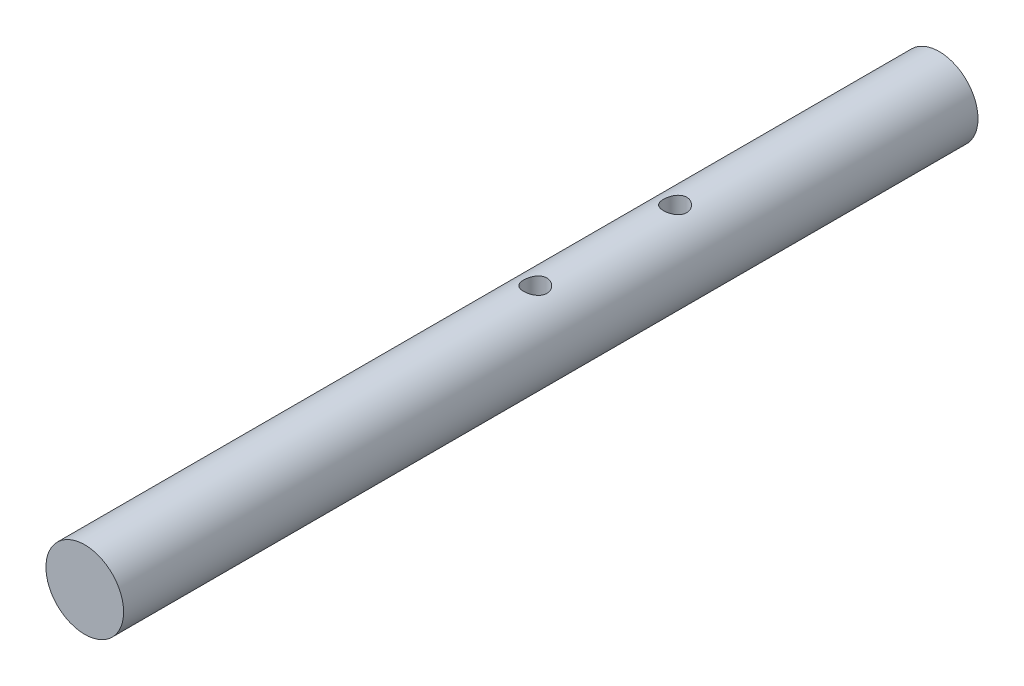
ISO-10303-21;
HEADER;
FILE_DESCRIPTION(('STEP AP214'),'2;1');
FILE_NAME('part.step','',(''),(''),'','','');
FILE_SCHEMA(('AUTOMOTIVE_DESIGN { 1 0 10303 214 1 1 1 1 }'));
ENDSEC;
DATA;
#1=APPLICATION_CONTEXT('core data for automotive mechanical design processes');
#2=APPLICATION_PROTOCOL_DEFINITION('international standard','automotive_design',2000,#1);
#3=PRODUCT_CONTEXT('',#1,'mechanical');
#4=PRODUCT('Part','Part','',(#3));
#5=PRODUCT_RELATED_PRODUCT_CATEGORY('part','',(#4));
#6=PRODUCT_DEFINITION_FORMATION('','',#4);
#7=PRODUCT_DEFINITION_CONTEXT('part definition',#1,'design');
#8=PRODUCT_DEFINITION('design','',#6,#7);
#9=PRODUCT_DEFINITION_SHAPE('','',#8);
#10=(LENGTH_UNIT() NAMED_UNIT(*) SI_UNIT(.MILLI.,.METRE.));
#11=(NAMED_UNIT(*) PLANE_ANGLE_UNIT() SI_UNIT($,.RADIAN.));
#12=(NAMED_UNIT(*) SI_UNIT($,.STERADIAN.) SOLID_ANGLE_UNIT());
#13=UNCERTAINTY_MEASURE_WITH_UNIT(LENGTH_MEASURE(1.E-05),#10,'distance_accuracy_value','');
#14=(GEOMETRIC_REPRESENTATION_CONTEXT(3) GLOBAL_UNCERTAINTY_ASSIGNED_CONTEXT((#13)) GLOBAL_UNIT_ASSIGNED_CONTEXT((#10,
#11,#12)) REPRESENTATION_CONTEXT('',''));
#15=CARTESIAN_POINT('',(0.,0.,0.));
#16=DIRECTION('',(0.,0.,1.));
#17=DIRECTION('',(1.,0.,0.));
#18=AXIS2_PLACEMENT_3D('',#15,#16,#17);
#19=CARTESIAN_POINT('',(0.,0.,55.));
#20=DIRECTION('',(0.,0.,-1.));
#21=DIRECTION('',(-1.,0.,0.));
#22=AXIS2_PLACEMENT_3D('',#19,#20,#21);
#23=CYLINDRICAL_SURFACE('',#22,5.);
#24=CARTESIAN_POINT('',(0.,-5.,-19.5));
#25=CARTESIAN_POINT('',(0.0822886127533002,-4.9999992925055,-19.5000009974849));
#26=CARTESIAN_POINT('',(0.16458731835153,-4.99794915693954,-19.506793863624));
#27=CARTESIAN_POINT('',(0.326788125304882,-4.98997105593691,-19.5337213542221));
#28=CARTESIAN_POINT('',(0.406689504411421,-4.98404193389692,-19.5538599580233));
#29=CARTESIAN_POINT('',(0.561732707754527,-4.96895552501836,-19.6067460169103));
#30=CARTESIAN_POINT('',(0.636881364395374,-4.95980300250425,-19.6394748696189));
#31=CARTESIAN_POINT('',(0.780624181053133,-4.93922109237645,-19.7165360930558));
#32=CARTESIAN_POINT('',(0.849217467469671,-4.92779140192067,-19.7608700073954));
#33=CARTESIAN_POINT('',(0.979871797183747,-4.90350737192774,-19.8612240074727));
#34=CARTESIAN_POINT('',(1.04171807124434,-4.89062383657036,-19.9175166258859));
#35=CARTESIAN_POINT('',(1.15524920923324,-4.86505834210442,-20.0396092299102));
#36=CARTESIAN_POINT('',(1.20693236327441,-4.85237641724501,-20.105410812125));
#37=CARTESIAN_POINT('',(1.29980037723708,-4.82834113993772,-20.2464707530376));
#38=CARTESIAN_POINT('',(1.34072309022214,-4.81702406663875,-20.3219084609907));
#39=CARTESIAN_POINT('',(1.40921394774761,-4.79743620394031,-20.4789892542303));
#40=CARTESIAN_POINT('',(1.43678529919973,-4.78916468313311,-20.560630843928));
#41=CARTESIAN_POINT('',(1.47701633682652,-4.77690870838434,-20.7253902661305));
#42=CARTESIAN_POINT('',(1.49007196234678,-4.77281069324533,-20.8084027438639));
#43=CARTESIAN_POINT('',(1.50213730614672,-4.76902789749767,-20.9755331562168));
#44=CARTESIAN_POINT('',(1.50115042761078,-4.76934204760571,-21.0596508180591));
#45=CARTESIAN_POINT('',(1.48546977199812,-4.77424744067778,-21.2233839086085));
#46=CARTESIAN_POINT('',(1.47127205262685,-4.7786838859914,-21.3030522503622));
#47=CARTESIAN_POINT('',(1.43037420427056,-4.79108356228624,-21.4588197862735));
#48=CARTESIAN_POINT('',(1.40367284141641,-4.79904714132351,-21.5349186273743));
#49=CARTESIAN_POINT('',(1.33816026653682,-4.81772733074973,-21.6826003496607));
#50=CARTESIAN_POINT('',(1.29918816934642,-4.82848016115952,-21.7541070839553));
#51=CARTESIAN_POINT('',(1.21035222588683,-4.85150987000065,-21.8897320220102));
#52=CARTESIAN_POINT('',(1.16048574002588,-4.86378711746991,-21.9538484294138));
#53=CARTESIAN_POINT('',(1.04881290765546,-4.88911011297937,-22.075686190762));
#54=CARTESIAN_POINT('',(0.98659490746697,-4.90216654310498,-22.1330286640297));
#55=CARTESIAN_POINT('',(0.853263259313965,-4.92712244063259,-22.2365539840643));
#56=CARTESIAN_POINT('',(0.782149051860885,-4.9390218351841,-22.2827361284144));
#57=CARTESIAN_POINT('',(0.632355038342801,-4.9604316006947,-22.3628599224647));
#58=CARTESIAN_POINT('',(0.553627749747948,-4.96992543668314,-22.3967175162499));
#59=CARTESIAN_POINT('',(0.391245415603517,-4.98533521832222,-22.4505995900996));
#60=CARTESIAN_POINT('',(0.307591751589579,-4.99125216186999,-22.4706279285325));
#61=CARTESIAN_POINT('',(0.140952242668329,-4.99868364643538,-22.4956521778994));
#62=CARTESIAN_POINT('',(0.0580500976011842,-5.0003485041779,-22.5011615858016));
#63=CARTESIAN_POINT('',(-0.107499605823385,-4.9995292324176,-22.4984308442879));
#64=CARTESIAN_POINT('',(-0.190147196690783,-4.99704565677756,-22.4901925303486));
#65=CARTESIAN_POINT('',(-0.350903605309699,-4.98830696987163,-22.4606153888885));
#66=CARTESIAN_POINT('',(-0.429072772614172,-4.98213829799417,-22.4395766124191));
#67=CARTESIAN_POINT('',(-0.580754638954524,-4.96674347841533,-22.3853567672218));
#68=CARTESIAN_POINT('',(-0.654266777025586,-4.95751696321085,-22.3521742389621));
#69=CARTESIAN_POINT('',(-0.796437189461054,-4.93669654351325,-22.2737468345189));
#70=CARTESIAN_POINT('',(-0.864943826199673,-4.92505280829675,-22.228240659052));
#71=CARTESIAN_POINT('',(-0.99352330798015,-4.90073468764317,-22.1267752459472));
#72=CARTESIAN_POINT('',(-1.05359403235594,-4.8880600443108,-22.0708133881123));
#73=CARTESIAN_POINT('',(-1.16585744551027,-4.86253171869138,-21.9476126916306));
#74=CARTESIAN_POINT('',(-1.21768481231504,-4.84968825033268,-21.8800381242283));
#75=CARTESIAN_POINT('',(-1.30928995072154,-4.82576515238464,-21.7368720609865));
#76=CARTESIAN_POINT('',(-1.34906803829472,-4.81468547654651,-21.6612807754418));
#77=CARTESIAN_POINT('',(-1.41517347127168,-4.79567189615055,-21.5044675087453));
#78=CARTESIAN_POINT('',(-1.4415634693705,-4.78772337843827,-21.4232738134634));
#79=CARTESIAN_POINT('',(-1.48021730815114,-4.77591594362794,-21.2573120310685));
#80=CARTESIAN_POINT('',(-1.49248598978779,-4.772055625083,-21.1725451792123));
#81=CARTESIAN_POINT('',(-1.50221984485059,-4.76899972496087,-21.0056384816238));
#82=CARTESIAN_POINT('',(-1.5002805530849,-4.76961647442754,-20.9235363489824));
#83=CARTESIAN_POINT('',(-1.48307505444814,-4.77499401288294,-20.7608858966272));
#84=CARTESIAN_POINT('',(-1.46780938124716,-4.77975463592551,-20.6803375148236));
#85=CARTESIAN_POINT('',(-1.42476888804136,-4.79275763670385,-20.5240546008571));
#86=CARTESIAN_POINT('',(-1.39715175507068,-4.80095604545965,-20.4482727126383));
#87=CARTESIAN_POINT('',(-1.33031507121129,-4.81990278909136,-20.3023575611823));
#88=CARTESIAN_POINT('',(-1.29109329962876,-4.83065161194312,-20.2322253823592));
#89=CARTESIAN_POINT('',(-1.20048763805072,-4.85397676425833,-20.0968368834729));
#90=CARTESIAN_POINT('',(-1.14871276092994,-4.86660540163798,-20.0318512387396));
#91=CARTESIAN_POINT('',(-1.03517434629782,-4.89201320450026,-19.9112975016921));
#92=CARTESIAN_POINT('',(-0.973408217134499,-4.90479240823905,-19.8557318605322));
#93=CARTESIAN_POINT('',(-0.839465762183247,-4.92950936570649,-19.753976587705));
#94=CARTESIAN_POINT('',(-0.767037885790606,-4.94141159765674,-19.7081085531445));
#95=CARTESIAN_POINT('',(-0.615141373983527,-4.96260680455813,-19.629264830096));
#96=CARTESIAN_POINT('',(-0.535676052998954,-4.97190099931066,-19.5962831117255));
#97=CARTESIAN_POINT('',(-0.38075771265528,-4.98602174969301,-19.5471047243472));
#98=CARTESIAN_POINT('',(-0.305786961954233,-4.99122027381068,-19.5294883271167));
#99=CARTESIAN_POINT('',(-0.153880195230778,-4.99820944494492,-19.5059364747584));
#100=CARTESIAN_POINT('',(-0.0769445098581389,-5.0000006615474,-19.4999990672952));
#101=CARTESIAN_POINT('',(0.,-5.,-19.5));
#102=B_SPLINE_CURVE_WITH_KNOTS('',3,(#24,#25,#26,#27,#28,#29,#30,#31,#32,#33,#34,#35,#36,#37,
#38,#39,#40,#41,#42,#43,#44,#45,#46,#47,#48,#49,#50,#51,#52,#53,#54,#55,#56,#57,#58,#59,#60,#61,
#62,#63,#64,#65,#66,#67,#68,#69,#70,#71,#72,#73,#74,#75,#76,#77,#78,#79,#80,#81,#82,#83,#84,#85,
#86,#87,#88,#89,#90,#91,#92,#93,#94,#95,#96,#97,#98,#99,#100,#101),.UNSPECIFIED.,.T.,.F.,(4,2,2,
2,2,2,2,2,2,2,2,2,2,2,2,2,2,2,2,2,2,2,2,2,2,2,2,2,2,2,2,2,2,2,2,2,2,2,4),(0.,0.246583203612611,
0.493239964846001,0.739533676300875,0.985860164412704,1.23855602948192,1.49129437288633,
1.74971481004109,2.00807314543224,2.25919689356599,2.5102597831909,2.75226016697677,
2.99428443658002,3.2396242644712,3.48502360158556,3.74067104048167,3.99633456531072,
4.25371046881689,4.51101453528808,4.75908809438546,5.00712853550327,5.24956746682328,
5.49203554593729,5.74011305702909,5.98825282000192,6.24540400322819,6.50254844252681,
6.75847814951252,7.01432009460284,7.25950155466943,7.504673196616,7.74680040402722,
7.98897397553108,8.23996925679932,8.49102974897503,8.74942996156672,9.00770911595236,
9.23831691930461,9.46888616948875),.UNSPECIFIED.);
#103=CARTESIAN_POINT('',(0.,-5.,-19.5));
#104=VERTEX_POINT('',#103);
#105=EDGE_CURVE('E10',#104,#104,#102,.T.);
#106=ORIENTED_EDGE('',*,*,#105,.T.);
#107=EDGE_LOOP('',(#106));
#108=FACE_BOUND('',#107,.T.);
#109=CARTESIAN_POINT('',(0.,5.,-19.5));
#110=CARTESIAN_POINT('',(-0.0822886127533002,4.9999992925055,-19.5000009974849));
#111=CARTESIAN_POINT('',(-0.16458731835153,4.99794915693954,-19.506793863624));
#112=CARTESIAN_POINT('',(-0.326788125304882,4.98997105593691,-19.5337213542221));
#113=CARTESIAN_POINT('',(-0.406689504411421,4.98404193389692,-19.5538599580233));
#114=CARTESIAN_POINT('',(-0.561732707754527,4.96895552501836,-19.6067460169103));
#115=CARTESIAN_POINT('',(-0.636881364395374,4.95980300250425,-19.6394748696189));
#116=CARTESIAN_POINT('',(-0.780624181053133,4.93922109237645,-19.7165360930558));
#117=CARTESIAN_POINT('',(-0.849217467469671,4.92779140192067,-19.7608700073954));
#118=CARTESIAN_POINT('',(-0.979871797183747,4.90350737192774,-19.8612240074727));
#119=CARTESIAN_POINT('',(-1.04171807124434,4.89062383657036,-19.9175166258859));
#120=CARTESIAN_POINT('',(-1.15524920923324,4.86505834210442,-20.0396092299102));
#121=CARTESIAN_POINT('',(-1.20693236327441,4.85237641724501,-20.105410812125));
#122=CARTESIAN_POINT('',(-1.29980037723708,4.82834113993772,-20.2464707530376));
#123=CARTESIAN_POINT('',(-1.34072309022214,4.81702406663875,-20.3219084609907));
#124=CARTESIAN_POINT('',(-1.40921394774761,4.79743620394031,-20.4789892542303));
#125=CARTESIAN_POINT('',(-1.43678529919973,4.78916468313311,-20.560630843928));
#126=CARTESIAN_POINT('',(-1.47701633682652,4.77690870838434,-20.7253902661305));
#127=CARTESIAN_POINT('',(-1.49007196234678,4.77281069324533,-20.8084027438639));
#128=CARTESIAN_POINT('',(-1.50213730614672,4.76902789749767,-20.9755331562168));
#129=CARTESIAN_POINT('',(-1.50115042761078,4.76934204760571,-21.0596508180591));
#130=CARTESIAN_POINT('',(-1.48546977199812,4.77424744067778,-21.2233839086085));
#131=CARTESIAN_POINT('',(-1.47127205262685,4.7786838859914,-21.3030522503622));
#132=CARTESIAN_POINT('',(-1.43037420427056,4.79108356228624,-21.4588197862735));
#133=CARTESIAN_POINT('',(-1.40367284141641,4.79904714132351,-21.5349186273743));
#134=CARTESIAN_POINT('',(-1.33816026653682,4.81772733074973,-21.6826003496607));
#135=CARTESIAN_POINT('',(-1.29918816934642,4.82848016115952,-21.7541070839553));
#136=CARTESIAN_POINT('',(-1.21035222588683,4.85150987000065,-21.8897320220102));
#137=CARTESIAN_POINT('',(-1.16048574002588,4.86378711746991,-21.9538484294138));
#138=CARTESIAN_POINT('',(-1.04881290765546,4.88911011297937,-22.075686190762));
#139=CARTESIAN_POINT('',(-0.98659490746697,4.90216654310498,-22.1330286640297));
#140=CARTESIAN_POINT('',(-0.853263259313965,4.92712244063259,-22.2365539840643));
#141=CARTESIAN_POINT('',(-0.782149051860885,4.9390218351841,-22.2827361284144));
#142=CARTESIAN_POINT('',(-0.632355038342801,4.9604316006947,-22.3628599224647));
#143=CARTESIAN_POINT('',(-0.553627749747948,4.96992543668314,-22.3967175162499));
#144=CARTESIAN_POINT('',(-0.391245415603517,4.98533521832222,-22.4505995900996));
#145=CARTESIAN_POINT('',(-0.307591751589579,4.99125216186999,-22.4706279285325));
#146=CARTESIAN_POINT('',(-0.140952242668329,4.99868364643538,-22.4956521778994));
#147=CARTESIAN_POINT('',(-0.0580500976011842,5.0003485041779,-22.5011615858016));
#148=CARTESIAN_POINT('',(0.107499605823385,4.9995292324176,-22.4984308442879));
#149=CARTESIAN_POINT('',(0.190147196690783,4.99704565677756,-22.4901925303486));
#150=CARTESIAN_POINT('',(0.350903605309699,4.98830696987163,-22.4606153888885));
#151=CARTESIAN_POINT('',(0.429072772614172,4.98213829799417,-22.4395766124191));
#152=CARTESIAN_POINT('',(0.580754638954524,4.96674347841533,-22.3853567672218));
#153=CARTESIAN_POINT('',(0.654266777025586,4.95751696321085,-22.3521742389621));
#154=CARTESIAN_POINT('',(0.796437189461054,4.93669654351325,-22.2737468345189));
#155=CARTESIAN_POINT('',(0.864943826199673,4.92505280829675,-22.228240659052));
#156=CARTESIAN_POINT('',(0.99352330798015,4.90073468764317,-22.1267752459472));
#157=CARTESIAN_POINT('',(1.05359403235594,4.8880600443108,-22.0708133881123));
#158=CARTESIAN_POINT('',(1.16585744551027,4.86253171869138,-21.9476126916306));
#159=CARTESIAN_POINT('',(1.21768481231504,4.84968825033268,-21.8800381242283));
#160=CARTESIAN_POINT('',(1.30928995072154,4.82576515238464,-21.7368720609865));
#161=CARTESIAN_POINT('',(1.34906803829472,4.81468547654651,-21.6612807754418));
#162=CARTESIAN_POINT('',(1.41517347127168,4.79567189615055,-21.5044675087453));
#163=CARTESIAN_POINT('',(1.4415634693705,4.78772337843827,-21.4232738134634));
#164=CARTESIAN_POINT('',(1.48021730815114,4.77591594362794,-21.2573120310685));
#165=CARTESIAN_POINT('',(1.49248598978779,4.772055625083,-21.1725451792123));
#166=CARTESIAN_POINT('',(1.50221984485059,4.76899972496087,-21.0056384816238));
#167=CARTESIAN_POINT('',(1.5002805530849,4.76961647442754,-20.9235363489824));
#168=CARTESIAN_POINT('',(1.48307505444814,4.77499401288294,-20.7608858966272));
#169=CARTESIAN_POINT('',(1.46780938124716,4.77975463592551,-20.6803375148236));
#170=CARTESIAN_POINT('',(1.42476888804136,4.79275763670385,-20.5240546008571));
#171=CARTESIAN_POINT('',(1.39715175507068,4.80095604545965,-20.4482727126383));
#172=CARTESIAN_POINT('',(1.33031507121129,4.81990278909136,-20.3023575611823));
#173=CARTESIAN_POINT('',(1.29109329962876,4.83065161194312,-20.2322253823592));
#174=CARTESIAN_POINT('',(1.20048763805072,4.85397676425833,-20.0968368834729));
#175=CARTESIAN_POINT('',(1.14871276092994,4.86660540163798,-20.0318512387396));
#176=CARTESIAN_POINT('',(1.03517434629782,4.89201320450026,-19.9112975016921));
#177=CARTESIAN_POINT('',(0.973408217134499,4.90479240823905,-19.8557318605322));
#178=CARTESIAN_POINT('',(0.839465762183247,4.92950936570649,-19.753976587705));
#179=CARTESIAN_POINT('',(0.767037885790606,4.94141159765674,-19.7081085531445));
#180=CARTESIAN_POINT('',(0.615141373983527,4.96260680455813,-19.629264830096));
#181=CARTESIAN_POINT('',(0.535676052998954,4.97190099931066,-19.5962831117255));
#182=CARTESIAN_POINT('',(0.38075771265528,4.98602174969301,-19.5471047243472));
#183=CARTESIAN_POINT('',(0.305786961954233,4.99122027381068,-19.5294883271167));
#184=CARTESIAN_POINT('',(0.153880195230778,4.99820944494492,-19.5059364747584));
#185=CARTESIAN_POINT('',(0.0769445098581389,5.0000006615474,-19.4999990672952));
#186=CARTESIAN_POINT('',(0.,5.,-19.5));
#187=B_SPLINE_CURVE_WITH_KNOTS('',3,(#109,#110,#111,#112,#113,#114,#115,#116,#117,#118,#119,
#120,#121,#122,#123,#124,#125,#126,#127,#128,#129,#130,#131,#132,#133,#134,#135,#136,#137,#138,
#139,#140,#141,#142,#143,#144,#145,#146,#147,#148,#149,#150,#151,#152,#153,#154,#155,#156,#157,
#158,#159,#160,#161,#162,#163,#164,#165,#166,#167,#168,#169,#170,#171,#172,#173,#174,#175,#176,
#177,#178,#179,#180,#181,#182,#183,#184,#185,#186),.UNSPECIFIED.,.T.,.F.,(4,2,2,2,2,2,2,2,2,2,2,
2,2,2,2,2,2,2,2,2,2,2,2,2,2,2,2,2,2,2,2,2,2,2,2,2,2,2,4),(0.,0.246583203612611,
0.493239964846001,0.739533676300875,0.985860164412704,1.23855602948192,1.49129437288633,
1.74971481004109,2.00807314543224,2.25919689356599,2.5102597831909,2.75226016697677,
2.99428443658002,3.2396242644712,3.48502360158556,3.74067104048167,3.99633456531072,
4.25371046881689,4.51101453528808,4.75908809438546,5.00712853550327,5.24956746682328,
5.49203554593729,5.74011305702909,5.98825282000192,6.24540400322819,6.50254844252681,
6.75847814951252,7.01432009460284,7.25950155466943,7.504673196616,7.74680040402722,
7.98897397553108,8.23996925679932,8.49102974897503,8.74942996156672,9.00770911595236,
9.23831691930461,9.46888616948875),.UNSPECIFIED.);
#188=CARTESIAN_POINT('',(0.,5.,-19.5));
#189=VERTEX_POINT('',#188);
#190=EDGE_CURVE('E42',#189,#189,#187,.T.);
#191=ORIENTED_EDGE('',*,*,#190,.T.);
#192=EDGE_LOOP('',(#191));
#193=FACE_BOUND('',#192,.T.);
#194=CARTESIAN_POINT('',(0.,-5.,-1.5));
#195=CARTESIAN_POINT('',(0.0822886127532999,-4.9999992925055,-1.50000099748489));
#196=CARTESIAN_POINT('',(0.164587318351529,-4.99794915693954,-1.50679386362397));
#197=CARTESIAN_POINT('',(0.326788125304881,-4.98997105593691,-1.5337213542221));
#198=CARTESIAN_POINT('',(0.40668950441142,-4.98404193389692,-1.55385995802334));
#199=CARTESIAN_POINT('',(0.561732707754527,-4.96895552501836,-1.60674601691026));
#200=CARTESIAN_POINT('',(0.636881364395373,-4.95980300250425,-1.63947486961894));
#201=CARTESIAN_POINT('',(0.780624181053131,-4.93922109237645,-1.71653609305583));
#202=CARTESIAN_POINT('',(0.849217467469669,-4.92779140192067,-1.76087000739542));
#203=CARTESIAN_POINT('',(0.979871797183745,-4.90350737192774,-1.86122400747267));
#204=CARTESIAN_POINT('',(1.04171807124434,-4.89062383657036,-1.91751662588591));
#205=CARTESIAN_POINT('',(1.15524920923324,-4.86505834210442,-2.03960922991018));
#206=CARTESIAN_POINT('',(1.20693236327441,-4.85237641724501,-2.10541081212496));
#207=CARTESIAN_POINT('',(1.29980037723708,-4.82834113993772,-2.24647075303761));
#208=CARTESIAN_POINT('',(1.34072309022213,-4.81702406663875,-2.32190846099074));
#209=CARTESIAN_POINT('',(1.4092139477476,-4.79743620394031,-2.47898925423029));
#210=CARTESIAN_POINT('',(1.43678529919973,-4.78916468313311,-2.56063084392797));
#211=CARTESIAN_POINT('',(1.47701633682652,-4.77690870838434,-2.72539026613046));
#212=CARTESIAN_POINT('',(1.49007196234677,-4.77281069324533,-2.80840274386394));
#213=CARTESIAN_POINT('',(1.50213730614672,-4.76902789749767,-2.97553315621676));
#214=CARTESIAN_POINT('',(1.50115042761078,-4.76934204760571,-3.05965081805909));
#215=CARTESIAN_POINT('',(1.48546977199812,-4.77424744067778,-3.22338390860848));
#216=CARTESIAN_POINT('',(1.47127205262685,-4.7786838859914,-3.30305225036224));
#217=CARTESIAN_POINT('',(1.43037420427056,-4.79108356228624,-3.45881978627346));
#218=CARTESIAN_POINT('',(1.40367284141641,-4.79904714132351,-3.53491862737433));
#219=CARTESIAN_POINT('',(1.33816026653682,-4.81772733074973,-3.68260034966074));
#220=CARTESIAN_POINT('',(1.29918816934643,-4.82848016115952,-3.75410708395526));
#221=CARTESIAN_POINT('',(1.21035222588683,-4.85150987000065,-3.88973202201019));
#222=CARTESIAN_POINT('',(1.16048574002588,-4.86378711746991,-3.95384842941378));
#223=CARTESIAN_POINT('',(1.04881290765546,-4.88911011297937,-4.07568619076202));
#224=CARTESIAN_POINT('',(0.986594907466972,-4.90216654310498,-4.13302866402967));
#225=CARTESIAN_POINT('',(0.853263259313967,-4.92712244063259,-4.23655398406425));
#226=CARTESIAN_POINT('',(0.782149051860888,-4.9390218351841,-4.28273612841443));
#227=CARTESIAN_POINT('',(0.632355038342804,-4.9604316006947,-4.36285992246473));
#228=CARTESIAN_POINT('',(0.553627749747951,-4.96992543668314,-4.39671751624986));
#229=CARTESIAN_POINT('',(0.39124541560352,-4.98533521832222,-4.45059959009963));
#230=CARTESIAN_POINT('',(0.307591751589582,-4.99125216186999,-4.47062792853249));
#231=CARTESIAN_POINT('',(0.140952242668332,-4.99868364643538,-4.49565217789939));
#232=CARTESIAN_POINT('',(0.0580500976011869,-5.0003485041779,-4.50116158580161));
#233=CARTESIAN_POINT('',(-0.107499605823383,-4.9995292324176,-4.49843084428792));
#234=CARTESIAN_POINT('',(-0.190147196690781,-4.99704565677756,-4.49019253034856));
#235=CARTESIAN_POINT('',(-0.350903605309697,-4.98830696987163,-4.4606153888885));
#236=CARTESIAN_POINT('',(-0.429072772614169,-4.98213829799417,-4.43957661241913));
#237=CARTESIAN_POINT('',(-0.580754638954522,-4.96674347841533,-4.3853567672218));
#238=CARTESIAN_POINT('',(-0.654266777025584,-4.95751696321085,-4.35217423896214));
#239=CARTESIAN_POINT('',(-0.796437189461053,-4.93669654351325,-4.27374683451887));
#240=CARTESIAN_POINT('',(-0.86494382619967,-4.92505280829675,-4.22824065905203));
#241=CARTESIAN_POINT('',(-0.993523307980147,-4.90073468764318,-4.12677524594719));
#242=CARTESIAN_POINT('',(-1.05359403235594,-4.8880600443108,-4.07081338811233));
#243=CARTESIAN_POINT('',(-1.16585744551027,-4.86253171869138,-3.94761269163065));
#244=CARTESIAN_POINT('',(-1.21768481231504,-4.84968825033268,-3.88003812422826));
#245=CARTESIAN_POINT('',(-1.30928995072154,-4.82576515238463,-3.73687206098647));
#246=CARTESIAN_POINT('',(-1.34906803829472,-4.81468547654651,-3.66128077544178));
#247=CARTESIAN_POINT('',(-1.41517347127168,-4.79567189615055,-3.50446750874531));
#248=CARTESIAN_POINT('',(-1.4415634693705,-4.78772337843827,-3.42327381346341));
#249=CARTESIAN_POINT('',(-1.48021730815114,-4.77591594362794,-3.25731203106852));
#250=CARTESIAN_POINT('',(-1.49248598978779,-4.772055625083,-3.17254517921233));
#251=CARTESIAN_POINT('',(-1.50221984485059,-4.76899972496087,-3.00563848162377));
#252=CARTESIAN_POINT('',(-1.5002805530849,-4.76961647442754,-2.92353634898241));
#253=CARTESIAN_POINT('',(-1.48307505444813,-4.77499401288294,-2.7608858966272));
#254=CARTESIAN_POINT('',(-1.46780938124716,-4.77975463592551,-2.68033751482365));
#255=CARTESIAN_POINT('',(-1.42476888804136,-4.79275763670386,-2.52405460085715));
#256=CARTESIAN_POINT('',(-1.39715175507069,-4.80095604545965,-2.44827271263831));
#257=CARTESIAN_POINT('',(-1.33031507121129,-4.81990278909136,-2.30235756118228));
#258=CARTESIAN_POINT('',(-1.29109329962876,-4.83065161194312,-2.23222538235924));
#259=CARTESIAN_POINT('',(-1.20048763805072,-4.85397676425833,-2.09683688347289));
#260=CARTESIAN_POINT('',(-1.14871276092994,-4.86660540163798,-2.03185123873959));
#261=CARTESIAN_POINT('',(-1.03517434629782,-4.89201320450026,-1.91129750169214));
#262=CARTESIAN_POINT('',(-0.973408217134502,-4.90479240823905,-1.85573186053224));
#263=CARTESIAN_POINT('',(-0.839465762183249,-4.92950936570649,-1.75397658770497));
#264=CARTESIAN_POINT('',(-0.767037885790608,-4.94141159765674,-1.70810855314451));
#265=CARTESIAN_POINT('',(-0.615141373983529,-4.96260680455813,-1.62926483009597));
#266=CARTESIAN_POINT('',(-0.535676052998955,-4.97190099931067,-1.59628311172549));
#267=CARTESIAN_POINT('',(-0.380757712655282,-4.98602174969301,-1.54710472434725));
#268=CARTESIAN_POINT('',(-0.305786961954235,-4.99122027381068,-1.52948832711675));
#269=CARTESIAN_POINT('',(-0.15388019523078,-4.99820944494492,-1.50593647475842));
#270=CARTESIAN_POINT('',(-0.0769445098581396,-5.0000006615474,-1.49999906729518));
#271=CARTESIAN_POINT('',(0.,-5.,-1.5));
#272=B_SPLINE_CURVE_WITH_KNOTS('',3,(#194,#195,#196,#197,#198,#199,#200,#201,#202,#203,#204,
#205,#206,#207,#208,#209,#210,#211,#212,#213,#214,#215,#216,#217,#218,#219,#220,#221,#222,#223,
#224,#225,#226,#227,#228,#229,#230,#231,#232,#233,#234,#235,#236,#237,#238,#239,#240,#241,#242,
#243,#244,#245,#246,#247,#248,#249,#250,#251,#252,#253,#254,#255,#256,#257,#258,#259,#260,#261,
#262,#263,#264,#265,#266,#267,#268,#269,#270,#271),.UNSPECIFIED.,.T.,.F.,(4,2,2,2,2,2,2,2,2,2,2,
2,2,2,2,2,2,2,2,2,2,2,2,2,2,2,2,2,2,2,2,2,2,2,2,2,2,2,4),(0.,0.246583203612611,0.493239964846,
0.739533676300874,0.985860164412702,1.23855602948191,1.49129437288633,1.74971481004109,
2.00807314543224,2.25919689356599,2.51025978319089,2.75226016697676,2.99428443658001,
3.2396242644712,3.48502360158556,3.74067104048167,3.99633456531072,4.25371046881689,
4.51101453528808,4.75908809438545,5.00712853550327,5.24956746682327,5.49203554593729,
5.74011305702908,5.98825282000191,6.24540400322819,6.50254844252681,6.75847814951252,
7.01432009460283,7.25950155466943,7.504673196616,7.74680040402721,7.98897397553107,
8.23996925679931,8.49102974897503,8.74942996156671,9.00770911595235,9.2383169193046,
9.46888616948875),.UNSPECIFIED.);
#273=CARTESIAN_POINT('',(0.,-5.,-1.5));
#274=VERTEX_POINT('',#273);
#275=EDGE_CURVE('E46',#274,#274,#272,.T.);
#276=ORIENTED_EDGE('',*,*,#275,.T.);
#277=EDGE_LOOP('',(#276));
#278=FACE_BOUND('',#277,.T.);
#279=CARTESIAN_POINT('',(0.,5.,-1.5));
#280=CARTESIAN_POINT('',(-0.0822886127532999,4.9999992925055,-1.50000099748489));
#281=CARTESIAN_POINT('',(-0.164587318351529,4.99794915693954,-1.50679386362397));
#282=CARTESIAN_POINT('',(-0.326788125304881,4.98997105593691,-1.5337213542221));
#283=CARTESIAN_POINT('',(-0.40668950441142,4.98404193389692,-1.55385995802334));
#284=CARTESIAN_POINT('',(-0.561732707754527,4.96895552501836,-1.60674601691026));
#285=CARTESIAN_POINT('',(-0.636881364395373,4.95980300250425,-1.63947486961894));
#286=CARTESIAN_POINT('',(-0.780624181053131,4.93922109237645,-1.71653609305583));
#287=CARTESIAN_POINT('',(-0.849217467469669,4.92779140192067,-1.76087000739542));
#288=CARTESIAN_POINT('',(-0.979871797183745,4.90350737192774,-1.86122400747267));
#289=CARTESIAN_POINT('',(-1.04171807124434,4.89062383657036,-1.91751662588591));
#290=CARTESIAN_POINT('',(-1.15524920923324,4.86505834210442,-2.03960922991018));
#291=CARTESIAN_POINT('',(-1.20693236327441,4.85237641724501,-2.10541081212496));
#292=CARTESIAN_POINT('',(-1.29980037723708,4.82834113993772,-2.24647075303761));
#293=CARTESIAN_POINT('',(-1.34072309022213,4.81702406663875,-2.32190846099074));
#294=CARTESIAN_POINT('',(-1.4092139477476,4.79743620394031,-2.47898925423029));
#295=CARTESIAN_POINT('',(-1.43678529919973,4.78916468313311,-2.56063084392797));
#296=CARTESIAN_POINT('',(-1.47701633682652,4.77690870838434,-2.72539026613046));
#297=CARTESIAN_POINT('',(-1.49007196234677,4.77281069324533,-2.80840274386394));
#298=CARTESIAN_POINT('',(-1.50213730614672,4.76902789749767,-2.97553315621676));
#299=CARTESIAN_POINT('',(-1.50115042761078,4.76934204760571,-3.05965081805909));
#300=CARTESIAN_POINT('',(-1.48546977199812,4.77424744067778,-3.22338390860848));
#301=CARTESIAN_POINT('',(-1.47127205262685,4.7786838859914,-3.30305225036224));
#302=CARTESIAN_POINT('',(-1.43037420427056,4.79108356228624,-3.45881978627346));
#303=CARTESIAN_POINT('',(-1.40367284141641,4.79904714132351,-3.53491862737433));
#304=CARTESIAN_POINT('',(-1.33816026653682,4.81772733074973,-3.68260034966074));
#305=CARTESIAN_POINT('',(-1.29918816934643,4.82848016115952,-3.75410708395526));
#306=CARTESIAN_POINT('',(-1.21035222588683,4.85150987000065,-3.88973202201019));
#307=CARTESIAN_POINT('',(-1.16048574002588,4.86378711746991,-3.95384842941378));
#308=CARTESIAN_POINT('',(-1.04881290765546,4.88911011297937,-4.07568619076202));
#309=CARTESIAN_POINT('',(-0.986594907466972,4.90216654310498,-4.13302866402967));
#310=CARTESIAN_POINT('',(-0.853263259313967,4.92712244063259,-4.23655398406425));
#311=CARTESIAN_POINT('',(-0.782149051860888,4.9390218351841,-4.28273612841443));
#312=CARTESIAN_POINT('',(-0.632355038342804,4.9604316006947,-4.36285992246473));
#313=CARTESIAN_POINT('',(-0.553627749747951,4.96992543668314,-4.39671751624986));
#314=CARTESIAN_POINT('',(-0.39124541560352,4.98533521832222,-4.45059959009963));
#315=CARTESIAN_POINT('',(-0.307591751589582,4.99125216186999,-4.47062792853249));
#316=CARTESIAN_POINT('',(-0.140952242668332,4.99868364643538,-4.49565217789939));
#317=CARTESIAN_POINT('',(-0.0580500976011869,5.0003485041779,-4.50116158580161));
#318=CARTESIAN_POINT('',(0.107499605823383,4.9995292324176,-4.49843084428792));
#319=CARTESIAN_POINT('',(0.190147196690781,4.99704565677756,-4.49019253034856));
#320=CARTESIAN_POINT('',(0.350903605309697,4.98830696987163,-4.4606153888885));
#321=CARTESIAN_POINT('',(0.429072772614169,4.98213829799417,-4.43957661241913));
#322=CARTESIAN_POINT('',(0.580754638954522,4.96674347841533,-4.3853567672218));
#323=CARTESIAN_POINT('',(0.654266777025584,4.95751696321085,-4.35217423896214));
#324=CARTESIAN_POINT('',(0.796437189461053,4.93669654351325,-4.27374683451887));
#325=CARTESIAN_POINT('',(0.86494382619967,4.92505280829675,-4.22824065905203));
#326=CARTESIAN_POINT('',(0.993523307980147,4.90073468764318,-4.12677524594719));
#327=CARTESIAN_POINT('',(1.05359403235594,4.8880600443108,-4.07081338811233));
#328=CARTESIAN_POINT('',(1.16585744551027,4.86253171869138,-3.94761269163065));
#329=CARTESIAN_POINT('',(1.21768481231504,4.84968825033268,-3.88003812422826));
#330=CARTESIAN_POINT('',(1.30928995072154,4.82576515238463,-3.73687206098647));
#331=CARTESIAN_POINT('',(1.34906803829472,4.81468547654651,-3.66128077544178));
#332=CARTESIAN_POINT('',(1.41517347127168,4.79567189615055,-3.50446750874531));
#333=CARTESIAN_POINT('',(1.4415634693705,4.78772337843827,-3.42327381346341));
#334=CARTESIAN_POINT('',(1.48021730815114,4.77591594362794,-3.25731203106852));
#335=CARTESIAN_POINT('',(1.49248598978779,4.772055625083,-3.17254517921233));
#336=CARTESIAN_POINT('',(1.50221984485059,4.76899972496087,-3.00563848162377));
#337=CARTESIAN_POINT('',(1.5002805530849,4.76961647442754,-2.92353634898241));
#338=CARTESIAN_POINT('',(1.48307505444813,4.77499401288294,-2.7608858966272));
#339=CARTESIAN_POINT('',(1.46780938124716,4.77975463592551,-2.68033751482365));
#340=CARTESIAN_POINT('',(1.42476888804136,4.79275763670386,-2.52405460085715));
#341=CARTESIAN_POINT('',(1.39715175507069,4.80095604545965,-2.44827271263831));
#342=CARTESIAN_POINT('',(1.33031507121129,4.81990278909136,-2.30235756118228));
#343=CARTESIAN_POINT('',(1.29109329962876,4.83065161194312,-2.23222538235924));
#344=CARTESIAN_POINT('',(1.20048763805072,4.85397676425833,-2.09683688347289));
#345=CARTESIAN_POINT('',(1.14871276092994,4.86660540163798,-2.03185123873959));
#346=CARTESIAN_POINT('',(1.03517434629782,4.89201320450026,-1.91129750169214));
#347=CARTESIAN_POINT('',(0.973408217134502,4.90479240823905,-1.85573186053224));
#348=CARTESIAN_POINT('',(0.839465762183249,4.92950936570649,-1.75397658770497));
#349=CARTESIAN_POINT('',(0.767037885790608,4.94141159765674,-1.70810855314451));
#350=CARTESIAN_POINT('',(0.615141373983529,4.96260680455813,-1.62926483009597));
#351=CARTESIAN_POINT('',(0.535676052998955,4.97190099931067,-1.59628311172549));
#352=CARTESIAN_POINT('',(0.380757712655282,4.98602174969301,-1.54710472434725));
#353=CARTESIAN_POINT('',(0.305786961954235,4.99122027381068,-1.52948832711675));
#354=CARTESIAN_POINT('',(0.15388019523078,4.99820944494492,-1.50593647475842));
#355=CARTESIAN_POINT('',(0.0769445098581396,5.0000006615474,-1.49999906729518));
#356=CARTESIAN_POINT('',(0.,5.,-1.5));
#357=B_SPLINE_CURVE_WITH_KNOTS('',3,(#279,#280,#281,#282,#283,#284,#285,#286,#287,#288,#289,
#290,#291,#292,#293,#294,#295,#296,#297,#298,#299,#300,#301,#302,#303,#304,#305,#306,#307,#308,
#309,#310,#311,#312,#313,#314,#315,#316,#317,#318,#319,#320,#321,#322,#323,#324,#325,#326,#327,
#328,#329,#330,#331,#332,#333,#334,#335,#336,#337,#338,#339,#340,#341,#342,#343,#344,#345,#346,
#347,#348,#349,#350,#351,#352,#353,#354,#355,#356),.UNSPECIFIED.,.T.,.F.,(4,2,2,2,2,2,2,2,2,2,2,
2,2,2,2,2,2,2,2,2,2,2,2,2,2,2,2,2,2,2,2,2,2,2,2,2,2,2,4),(0.,0.246583203612611,0.493239964846,
0.739533676300874,0.985860164412702,1.23855602948191,1.49129437288633,1.74971481004109,
2.00807314543224,2.25919689356599,2.51025978319089,2.75226016697676,2.99428443658001,
3.2396242644712,3.48502360158556,3.74067104048167,3.99633456531072,4.25371046881689,
4.51101453528808,4.75908809438545,5.00712853550327,5.24956746682327,5.49203554593729,
5.74011305702908,5.98825282000191,6.24540400322819,6.50254844252681,6.75847814951252,
7.01432009460283,7.25950155466943,7.504673196616,7.74680040402721,7.98897397553107,
8.23996925679931,8.49102974897503,8.74942996156671,9.00770911595235,9.2383169193046,
9.46888616948875),.UNSPECIFIED.);
#358=CARTESIAN_POINT('',(0.,5.,-1.5));
#359=VERTEX_POINT('',#358);
#360=EDGE_CURVE('E50',#359,#359,#357,.T.);
#361=ORIENTED_EDGE('',*,*,#360,.T.);
#362=EDGE_LOOP('',(#361));
#363=FACE_BOUND('',#362,.T.);
#364=CARTESIAN_POINT('',(0.,0.,55.));
#365=DIRECTION('',(0.,0.,1.));
#366=DIRECTION('',(1.,0.,0.));
#367=AXIS2_PLACEMENT_3D('',#364,#365,#366);
#368=CIRCLE('',#367,5.);
#369=CARTESIAN_POINT('',(5.,0.,55.));
#370=VERTEX_POINT('',#369);
#371=EDGE_CURVE('E78',#370,#370,#368,.T.);
#372=ORIENTED_EDGE('',*,*,#371,.F.);
#373=EDGE_LOOP('',(#372));
#374=FACE_BOUND('',#373,.T.);
#375=CARTESIAN_POINT('',(0.,0.,-55.));
#376=DIRECTION('',(0.,0.,1.));
#377=DIRECTION('',(1.,0.,0.));
#378=AXIS2_PLACEMENT_3D('',#375,#376,#377);
#379=CIRCLE('',#378,5.);
#380=CARTESIAN_POINT('',(5.,0.,-55.));
#381=VERTEX_POINT('',#380);
#382=EDGE_CURVE('E79',#381,#381,#379,.T.);
#383=ORIENTED_EDGE('',*,*,#382,.T.);
#384=EDGE_LOOP('',(#383));
#385=FACE_BOUND('',#384,.T.);
#386=ADVANCED_FACE('F31',(#108,#193,#278,#363,#374,#385),#23,.T.);
#387=CARTESIAN_POINT('',(0.,0.,55.));
#388=DIRECTION('',(0.,0.,1.));
#389=DIRECTION('',(1.,0.,0.));
#390=AXIS2_PLACEMENT_3D('',#387,#388,#389);
#391=PLANE('',#390);
#392=ORIENTED_EDGE('',*,*,#371,.T.);
#393=EDGE_LOOP('',(#392));
#394=FACE_BOUND('',#393,.T.);
#395=ADVANCED_FACE('F71',(#394),#391,.T.);
#396=CARTESIAN_POINT('',(0.,0.,-55.));
#397=DIRECTION('',(0.,0.,1.));
#398=DIRECTION('',(1.,0.,0.));
#399=AXIS2_PLACEMENT_3D('',#396,#397,#398);
#400=PLANE('',#399);
#401=ORIENTED_EDGE('',*,*,#382,.F.);
#402=EDGE_LOOP('',(#401));
#403=FACE_BOUND('',#402,.T.);
#404=ADVANCED_FACE('F69',(#403),#400,.F.);
#405=CARTESIAN_POINT('',(0.,-5.,-3.));
#406=DIRECTION('',(0.,1.,0.));
#407=DIRECTION('',(0.,0.,1.));
#408=AXIS2_PLACEMENT_3D('',#405,#406,#407);
#409=CYLINDRICAL_SURFACE('',#408,1.5);
#410=ORIENTED_EDGE('',*,*,#360,.F.);
#411=EDGE_LOOP('',(#410));
#412=FACE_BOUND('',#411,.T.);
#413=ORIENTED_EDGE('',*,*,#275,.F.);
#414=EDGE_LOOP('',(#413));
#415=FACE_BOUND('',#414,.T.);
#416=ADVANCED_FACE('F63',(#412,#415),#409,.F.);
#417=CARTESIAN_POINT('',(0.,-5.,-21.));
#418=DIRECTION('',(0.,1.,0.));
#419=DIRECTION('',(0.,0.,1.));
#420=AXIS2_PLACEMENT_3D('',#417,#418,#419);
#421=CYLINDRICAL_SURFACE('',#420,1.5);
#422=ORIENTED_EDGE('',*,*,#190,.F.);
#423=EDGE_LOOP('',(#422));
#424=FACE_BOUND('',#423,.T.);
#425=ORIENTED_EDGE('',*,*,#105,.F.);
#426=EDGE_LOOP('',(#425));
#427=FACE_BOUND('',#426,.T.);
#428=ADVANCED_FACE('F60',(#424,#427),#421,.F.);
#429=CLOSED_SHELL('',(#386,#395,#404,#416,#428));
#430=MANIFOLD_SOLID_BREP('B2',#429);
#431=ADVANCED_BREP_SHAPE_REPRESENTATION('',(#18,#430),#14);
#432=SHAPE_DEFINITION_REPRESENTATION(#9,#431);
ENDSEC;
END-ISO-10303-21;
